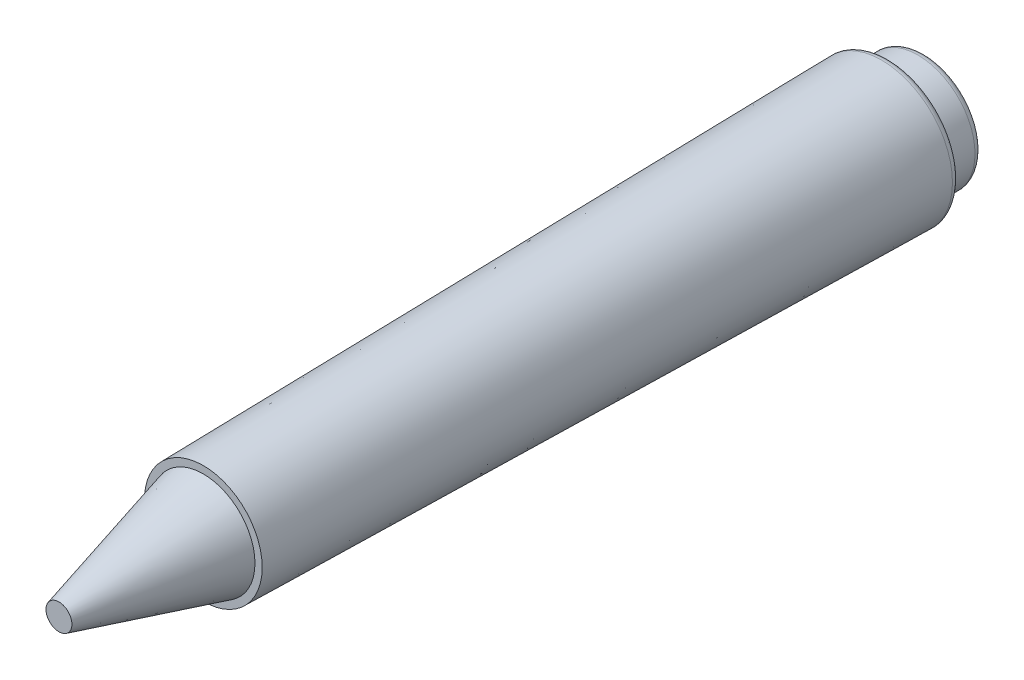
ISO-10303-21;
HEADER;
FILE_DESCRIPTION(('STEP AP214'),'2;1');
FILE_NAME('part.step','',(''),(''),'','','');
FILE_SCHEMA(('AUTOMOTIVE_DESIGN { 1 0 10303 214 1 1 1 1 }'));
ENDSEC;
DATA;
#1=APPLICATION_CONTEXT('core data for automotive mechanical design processes');
#2=APPLICATION_PROTOCOL_DEFINITION('international standard','automotive_design',2000,#1);
#3=PRODUCT_CONTEXT('',#1,'mechanical');
#4=PRODUCT('Part','Part','',(#3));
#5=PRODUCT_RELATED_PRODUCT_CATEGORY('part','',(#4));
#6=PRODUCT_DEFINITION_FORMATION('','',#4);
#7=PRODUCT_DEFINITION_CONTEXT('part definition',#1,'design');
#8=PRODUCT_DEFINITION('design','',#6,#7);
#9=PRODUCT_DEFINITION_SHAPE('','',#8);
#10=(LENGTH_UNIT() NAMED_UNIT(*) SI_UNIT(.MILLI.,.METRE.));
#11=(NAMED_UNIT(*) PLANE_ANGLE_UNIT() SI_UNIT($,.RADIAN.));
#12=(NAMED_UNIT(*) SI_UNIT($,.STERADIAN.) SOLID_ANGLE_UNIT());
#13=UNCERTAINTY_MEASURE_WITH_UNIT(LENGTH_MEASURE(1.E-05),#10,'distance_accuracy_value','');
#14=(GEOMETRIC_REPRESENTATION_CONTEXT(3) GLOBAL_UNCERTAINTY_ASSIGNED_CONTEXT((#13)) GLOBAL_UNIT_ASSIGNED_CONTEXT((#10,
#11,#12)) REPRESENTATION_CONTEXT('',''));
#15=CARTESIAN_POINT('',(0.,0.,0.));
#16=DIRECTION('',(0.,0.,1.));
#17=DIRECTION('',(1.,0.,0.));
#18=AXIS2_PLACEMENT_3D('',#15,#16,#17);
#19=CARTESIAN_POINT('',(0.,0.,100.));
#20=DIRECTION('',(0.,0.,-1.));
#21=DIRECTION('',(1.,0.,0.));
#22=AXIS2_PLACEMENT_3D('',#19,#20,#21);
#23=CONICAL_SURFACE('',#22,7.15449350717824,0.26179938779915);
#24=CARTESIAN_POINT('',(0.,0.,120.));
#25=DIRECTION('',(0.,0.,1.));
#26=DIRECTION('',(1.,0.,0.));
#27=AXIS2_PLACEMENT_3D('',#24,#25,#26);
#28=CIRCLE('',#27,1.79550965855577);
#29=CARTESIAN_POINT('',(1.79550965855577,0.,120.));
#30=VERTEX_POINT('',#29);
#31=EDGE_CURVE('E11',#30,#30,#28,.T.);
#32=CARTESIAN_POINT('',(0.,0.,100.));
#33=DIRECTION('',(0.,0.,1.));
#34=DIRECTION('',(1.,0.,0.));
#35=AXIS2_PLACEMENT_3D('',#32,#33,#34);
#36=CIRCLE('',#35,7.15449350717824);
#37=CARTESIAN_POINT('',(7.15449350717824,0.,100.));
#38=VERTEX_POINT('',#37);
#39=EDGE_CURVE('E53',#38,#38,#36,.T.);
#40=CARTESIAN_POINT('',(1.79550965855577,0.,120.));
#41=CARTESIAN_POINT('',(1.85133240697893,0.,119.791666666667));
#42=CARTESIAN_POINT('',(1.90715515540208,0.,119.583333333333));
#43=CARTESIAN_POINT('',(2.01880065224838,0.,119.166666666667));
#44=CARTESIAN_POINT('',(2.07462340067152,0.,118.958333333333));
#45=CARTESIAN_POINT('',(2.18626889751783,0.,118.541666666667));
#46=CARTESIAN_POINT('',(2.24209164594098,0.,118.333333333333));
#47=CARTESIAN_POINT('',(2.35373714278728,0.,117.916666666667));
#48=CARTESIAN_POINT('',(2.40955989121043,0.,117.708333333333));
#49=CARTESIAN_POINT('',(2.52120538805673,0.,117.291666666667));
#50=CARTESIAN_POINT('',(2.57702813647988,0.,117.083333333333));
#51=CARTESIAN_POINT('',(2.68867363332618,0.,116.666666666667));
#52=CARTESIAN_POINT('',(2.74449638174933,0.,116.458333333333));
#53=CARTESIAN_POINT('',(2.85614187859564,0.,116.041666666667));
#54=CARTESIAN_POINT('',(2.91196462701879,0.,115.833333333333));
#55=CARTESIAN_POINT('',(3.02361012386509,0.,115.416666666667));
#56=CARTESIAN_POINT('',(3.07943287228824,0.,115.208333333333));
#57=CARTESIAN_POINT('',(3.19107836913454,0.,114.791666666667));
#58=CARTESIAN_POINT('',(3.24690111755769,0.,114.583333333333));
#59=CARTESIAN_POINT('',(3.35854661440399,0.,114.166666666667));
#60=CARTESIAN_POINT('',(3.41436936282714,0.,113.958333333333));
#61=CARTESIAN_POINT('',(3.52601485967344,0.,113.541666666667));
#62=CARTESIAN_POINT('',(3.5818376080966,0.,113.333333333333));
#63=CARTESIAN_POINT('',(3.6934831049429,0.,112.916666666667));
#64=CARTESIAN_POINT('',(3.74930585336605,0.,112.708333333333));
#65=CARTESIAN_POINT('',(3.86095135021235,0.,112.291666666667));
#66=CARTESIAN_POINT('',(3.9167740986355,0.,112.083333333333));
#67=CARTESIAN_POINT('',(4.0284195954818,0.,111.666666666667));
#68=CARTESIAN_POINT('',(4.08424234390495,0.,111.458333333333));
#69=CARTESIAN_POINT('',(4.19588784075125,0.,111.041666666667));
#70=CARTESIAN_POINT('',(4.2517105891744,0.,110.833333333333));
#71=CARTESIAN_POINT('',(4.36335608602071,0.,110.416666666667));
#72=CARTESIAN_POINT('',(4.41917883444386,0.,110.208333333333));
#73=CARTESIAN_POINT('',(4.53082433129016,0.,109.791666666667));
#74=CARTESIAN_POINT('',(4.58664707971331,0.,109.583333333333));
#75=CARTESIAN_POINT('',(4.69829257655961,0.,109.166666666667));
#76=CARTESIAN_POINT('',(4.75411532498276,0.,108.958333333333));
#77=CARTESIAN_POINT('',(4.86576082182906,0.,108.541666666667));
#78=CARTESIAN_POINT('',(4.92158357025221,0.,108.333333333333));
#79=CARTESIAN_POINT('',(5.03322906709851,0.,107.916666666667));
#80=CARTESIAN_POINT('',(5.08905181552166,0.,107.708333333333));
#81=CARTESIAN_POINT('',(5.20069731236797,0.,107.291666666667));
#82=CARTESIAN_POINT('',(5.25652006079112,0.,107.083333333333));
#83=CARTESIAN_POINT('',(5.36816555763742,0.,106.666666666667));
#84=CARTESIAN_POINT('',(5.42398830606057,0.,106.458333333333));
#85=CARTESIAN_POINT('',(5.53563380290687,0.,106.041666666667));
#86=CARTESIAN_POINT('',(5.59145655133002,0.,105.833333333333));
#87=CARTESIAN_POINT('',(5.70310204817632,0.,105.416666666667));
#88=CARTESIAN_POINT('',(5.75892479659947,0.,105.208333333333));
#89=CARTESIAN_POINT('',(5.87057029344577,0.,104.791666666667));
#90=CARTESIAN_POINT('',(5.92639304186892,0.,104.583333333333));
#91=CARTESIAN_POINT('',(6.03803853871523,0.,104.166666666667));
#92=CARTESIAN_POINT('',(6.09386128713838,0.,103.958333333333));
#93=CARTESIAN_POINT('',(6.20550678398468,0.,103.541666666667));
#94=CARTESIAN_POINT('',(6.26132953240783,0.,103.333333333333));
#95=CARTESIAN_POINT('',(6.37297502925413,0.,102.916666666667));
#96=CARTESIAN_POINT('',(6.42879777767728,0.,102.708333333333));
#97=CARTESIAN_POINT('',(6.54044327452358,0.,102.291666666667));
#98=CARTESIAN_POINT('',(6.59626602294673,0.,102.083333333333));
#99=CARTESIAN_POINT('',(6.70791151979303,0.,101.666666666667));
#100=CARTESIAN_POINT('',(6.76373426821619,0.,101.458333333333));
#101=CARTESIAN_POINT('',(6.87537976506249,0.,101.041666666667));
#102=CARTESIAN_POINT('',(6.93120251348564,0.,100.833333333333));
#103=CARTESIAN_POINT('',(7.04284801033194,0.,100.416666666667));
#104=CARTESIAN_POINT('',(7.09867075875509,0.,100.208333333333));
#105=CARTESIAN_POINT('',(7.15449350717824,0.,100.));
#106=B_SPLINE_CURVE_WITH_KNOTS('',3,(#40,#41,#42,#43,#44,#45,#46,#47,#48,#49,#50,#51,#52,#53,
#54,#55,#56,#57,#58,#59,#60,#61,#62,#63,#64,#65,#66,#67,#68,#69,#70,#71,#72,#73,#74,#75,#76,#77,
#78,#79,#80,#81,#82,#83,#84,#85,#86,#87,#88,#89,#90,#91,#92,#93,#94,#95,#96,#97,#98,#99,#100,
#101,#102,#103,#104,#105),.UNSPECIFIED.,.F.,.F.,(4,2,2,2,2,2,2,2,2,2,2,2,2,2,2,2,2,2,2,2,2,2,2,
2,2,2,2,2,2,2,2,2,4),(0.,0.647047612756289,1.29409522551261,1.94114283826889,2.58819045102521,
3.2352380637815,3.8822856765378,4.5293332892941,5.17638090205041,5.82342851480671,
6.47047612756301,7.11752374031932,7.76457135307562,8.41161896583192,9.05866657858822,
9.70571419134452,10.3527618041008,10.9998094168571,11.6468570296134,12.2939046423697,
12.940952255126,13.5879998678823,14.2350474806386,14.8820950933949,15.5291427061512,
16.1761903189075,16.8232379316638,17.4702855444201,18.1173331571764,18.7643807699327,
19.411428382689,20.0584759954454,20.7055236082016),.UNSPECIFIED.);
#107=EDGE_CURVE('BSEAM47',#30,#38,#106,.T.);
#108=ORIENTED_EDGE('',*,*,#31,.F.);
#109=ORIENTED_EDGE('',*,*,#39,.T.);
#110=ORIENTED_EDGE('',*,*,#107,.T.);
#111=ORIENTED_EDGE('',*,*,#107,.F.);
#112=EDGE_LOOP('',(#108,#110,#109,#111));
#113=FACE_BOUND('',#112,.T.);
#114=ADVANCED_FACE('F47',(#113),#23,.T.);
#115=CARTESIAN_POINT('',(0.,0.,120.));
#116=DIRECTION('',(0.,0.,1.));
#117=DIRECTION('',(1.,0.,0.));
#118=AXIS2_PLACEMENT_3D('',#115,#116,#117);
#119=PLANE('',#118);
#120=ORIENTED_EDGE('',*,*,#31,.T.);
#121=EDGE_LOOP('',(#120));
#122=FACE_BOUND('',#121,.T.);
#123=ADVANCED_FACE('F62',(#122),#119,.T.);
#124=CARTESIAN_POINT('',(0.,0.,100.));
#125=DIRECTION('',(0.,0.,1.));
#126=DIRECTION('',(1.,0.,0.));
#127=AXIS2_PLACEMENT_3D('',#124,#125,#126);
#128=PLANE('',#127);
#129=ORIENTED_EDGE('',*,*,#39,.F.);
#130=EDGE_LOOP('',(#129));
#131=FACE_BOUND('',#130,.T.);
#132=ADVANCED_FACE('F60',(#131),#128,.F.);
#133=CLOSED_SHELL('',(#114,#123,#132));
#134=MANIFOLD_SOLID_BREP('B2',#133);
#135=CARTESIAN_POINT('',(0.,0.,6.));
#136=DIRECTION('',(0.,0.,-1.));
#137=DIRECTION('',(-1.,0.,0.));
#138=AXIS2_PLACEMENT_3D('',#135,#136,#137);
#139=TOROIDAL_SURFACE('',#138,8.79511728238679,1.);
#140=CARTESIAN_POINT('',(0.,0.,5.));
#141=DIRECTION('',(0.,0.,-1.));
#142=DIRECTION('',(-1.,0.,0.));
#143=AXIS2_PLACEMENT_3D('',#140,#141,#142);
#144=CIRCLE('',#143,8.79511728238679);
#145=CARTESIAN_POINT('',(-8.79511728238679,0.,5.));
#146=VERTEX_POINT('',#145);
#147=EDGE_CURVE('E100',#146,#146,#144,.T.);
#148=ORIENTED_EDGE('',*,*,#147,.F.);
#149=EDGE_LOOP('',(#148));
#150=FACE_BOUND('',#149,.T.);
#151=CARTESIAN_POINT('',(0.,0.,6.01745240643728));
#152=DIRECTION('',(0.,0.,-1.));
#153=DIRECTION('',(-1.,0.,0.));
#154=AXIS2_PLACEMENT_3D('',#151,#152,#153);
#155=CIRCLE('',#154,9.79496497754318);
#156=CARTESIAN_POINT('',(-9.79496497754318,0.,6.01745240643728));
#157=VERTEX_POINT('',#156);
#158=EDGE_CURVE('E46',#157,#157,#155,.F.);
#159=ORIENTED_EDGE('',*,*,#158,.F.);
#160=EDGE_LOOP('',(#159));
#161=FACE_BOUND('',#160,.T.);
#162=ADVANCED_FACE('F94',(#150,#161),#139,.T.);
#163=CARTESIAN_POINT('',(0.,0.,1.));
#164=DIRECTION('',(0.,0.,1.));
#165=DIRECTION('',(1.,0.,0.));
#166=AXIS2_PLACEMENT_3D('',#163,#164,#165);
#167=TOROIDAL_SURFACE('',#166,6.9,1.);
#168=CARTESIAN_POINT('',(0.,0.,0.));
#169=DIRECTION('',(0.,0.,1.));
#170=DIRECTION('',(1.,0.,0.));
#171=AXIS2_PLACEMENT_3D('',#168,#169,#170);
#172=CIRCLE('',#171,6.9);
#173=CARTESIAN_POINT('',(6.9,0.,0.));
#174=VERTEX_POINT('',#173);
#175=EDGE_CURVE('E108',#174,#174,#172,.F.);
#176=ORIENTED_EDGE('',*,*,#175,.F.);
#177=EDGE_LOOP('',(#176));
#178=FACE_BOUND('',#177,.T.);
#179=CARTESIAN_POINT('',(0.,0.,1.));
#180=DIRECTION('',(0.,0.,1.));
#181=DIRECTION('',(1.,0.,0.));
#182=AXIS2_PLACEMENT_3D('',#179,#180,#181);
#183=CIRCLE('',#182,7.9);
#184=CARTESIAN_POINT('',(7.9,0.,1.));
#185=VERTEX_POINT('',#184);
#186=EDGE_CURVE('E104',#185,#185,#183,.T.);
#187=ORIENTED_EDGE('',*,*,#186,.F.);
#188=EDGE_LOOP('',(#187));
#189=FACE_BOUND('',#188,.T.);
#190=ADVANCED_FACE('F137',(#178,#189),#167,.T.);
#191=CARTESIAN_POINT('',(0.,0.,0.));
#192=DIRECTION('',(0.,0.,-1.));
#193=DIRECTION('',(1.,0.,0.));
#194=AXIS2_PLACEMENT_3D('',#191,#192,#193);
#195=CONICAL_SURFACE('',#194,9.9,0.0174532925199433);
#196=ORIENTED_EDGE('',*,*,#158,.T.);
#197=EDGE_LOOP('',(#196));
#198=FACE_BOUND('',#197,.T.);
#199=CARTESIAN_POINT('',(0.,0.,100.));
#200=DIRECTION('',(0.,0.,1.));
#201=DIRECTION('',(1.,0.,0.));
#202=AXIS2_PLACEMENT_3D('',#199,#200,#201);
#203=CIRCLE('',#202,8.15449350717824);
#204=CARTESIAN_POINT('',(8.15449350717824,0.,100.));
#205=VERTEX_POINT('',#204);
#206=EDGE_CURVE('E113',#205,#205,#203,.T.);
#207=ORIENTED_EDGE('',*,*,#206,.F.);
#208=EDGE_LOOP('',(#207));
#209=FACE_BOUND('',#208,.T.);
#210=ADVANCED_FACE('F133',(#198,#209),#195,.T.);
#211=CARTESIAN_POINT('',(0.,0.,100.));
#212=DIRECTION('',(0.,0.,1.));
#213=DIRECTION('',(1.,0.,0.));
#214=AXIS2_PLACEMENT_3D('',#211,#212,#213);
#215=PLANE('',#214);
#216=ORIENTED_EDGE('',*,*,#206,.T.);
#217=EDGE_LOOP('',(#216));
#218=FACE_BOUND('',#217,.T.);
#219=ADVANCED_FACE('F124',(#218),#215,.T.);
#220=CARTESIAN_POINT('',(0.,0.,5.));
#221=DIRECTION('',(0.,0.,-1.));
#222=DIRECTION('',(-1.,0.,0.));
#223=AXIS2_PLACEMENT_3D('',#220,#221,#222);
#224=PLANE('',#223);
#225=ORIENTED_EDGE('',*,*,#147,.T.);
#226=EDGE_LOOP('',(#225));
#227=FACE_BOUND('',#226,.T.);
#228=CARTESIAN_POINT('',(0.,0.,5.));
#229=DIRECTION('',(0.,0.,-1.));
#230=DIRECTION('',(-1.,0.,0.));
#231=AXIS2_PLACEMENT_3D('',#228,#229,#230);
#232=CIRCLE('',#231,7.9);
#233=CARTESIAN_POINT('',(-7.9,0.,5.));
#234=VERTEX_POINT('',#233);
#235=EDGE_CURVE('E116',#234,#234,#232,.T.);
#236=ORIENTED_EDGE('',*,*,#235,.F.);
#237=EDGE_LOOP('',(#236));
#238=FACE_BOUND('',#237,.T.);
#239=ADVANCED_FACE('F122',(#227,#238),#224,.T.);
#240=CARTESIAN_POINT('',(0.,0.,5.));
#241=DIRECTION('',(0.,0.,-1.));
#242=DIRECTION('',(-1.,0.,0.));
#243=AXIS2_PLACEMENT_3D('',#240,#241,#242);
#244=CYLINDRICAL_SURFACE('',#243,7.9);
#245=ORIENTED_EDGE('',*,*,#186,.T.);
#246=EDGE_LOOP('',(#245));
#247=FACE_BOUND('',#246,.T.);
#248=ORIENTED_EDGE('',*,*,#235,.T.);
#249=EDGE_LOOP('',(#248));
#250=FACE_BOUND('',#249,.T.);
#251=ADVANCED_FACE('F120',(#247,#250),#244,.T.);
#252=CARTESIAN_POINT('',(0.,0.,0.));
#253=DIRECTION('',(0.,0.,1.));
#254=DIRECTION('',(1.,0.,0.));
#255=AXIS2_PLACEMENT_3D('',#252,#253,#254);
#256=PLANE('',#255);
#257=ORIENTED_EDGE('',*,*,#175,.T.);
#258=EDGE_LOOP('',(#257));
#259=FACE_BOUND('',#258,.T.);
#260=ADVANCED_FACE('F130',(#259),#256,.F.);
#261=CLOSED_SHELL('',(#162,#190,#210,#219,#239,#251,#260));
#262=MANIFOLD_SOLID_BREP('B6',#261);
#263=ADVANCED_BREP_SHAPE_REPRESENTATION('',(#18,#134,#262),#14);
#264=SHAPE_DEFINITION_REPRESENTATION(#9,#263);
ENDSEC;
END-ISO-10303-21;
